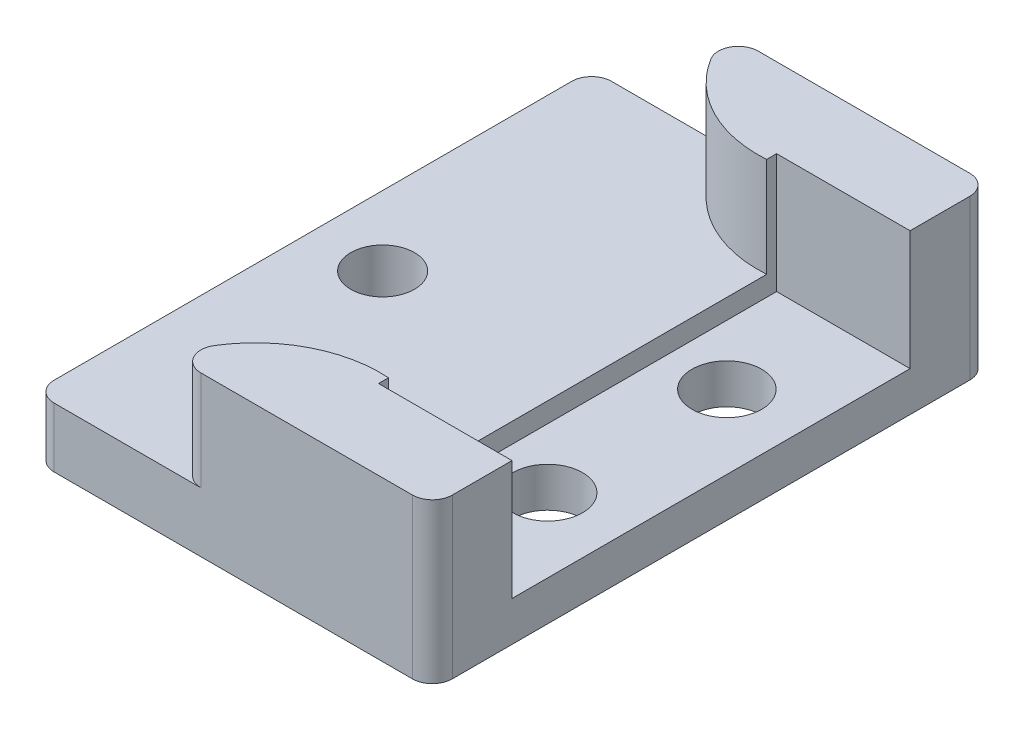
ISO-10303-21;
HEADER;
FILE_DESCRIPTION(('STEP AP214'),'2;1');
FILE_NAME('part.step','',(''),(''),'','','');
FILE_SCHEMA(('AUTOMOTIVE_DESIGN { 1 0 10303 214 1 1 1 1 }'));
ENDSEC;
DATA;
#1=APPLICATION_CONTEXT('core data for automotive mechanical design processes');
#2=APPLICATION_PROTOCOL_DEFINITION('international standard','automotive_design',2000,#1);
#3=PRODUCT_CONTEXT('',#1,'mechanical');
#4=PRODUCT('Part','Part','',(#3));
#5=PRODUCT_RELATED_PRODUCT_CATEGORY('part','',(#4));
#6=PRODUCT_DEFINITION_FORMATION('','',#4);
#7=PRODUCT_DEFINITION_CONTEXT('part definition',#1,'design');
#8=PRODUCT_DEFINITION('design','',#6,#7);
#9=PRODUCT_DEFINITION_SHAPE('','',#8);
#10=(LENGTH_UNIT() NAMED_UNIT(*) SI_UNIT(.MILLI.,.METRE.));
#11=(NAMED_UNIT(*) PLANE_ANGLE_UNIT() SI_UNIT($,.RADIAN.));
#12=(NAMED_UNIT(*) SI_UNIT($,.STERADIAN.) SOLID_ANGLE_UNIT());
#13=UNCERTAINTY_MEASURE_WITH_UNIT(LENGTH_MEASURE(1.E-05),#10,'distance_accuracy_value','');
#14=(GEOMETRIC_REPRESENTATION_CONTEXT(3) GLOBAL_UNCERTAINTY_ASSIGNED_CONTEXT((#13)) GLOBAL_UNIT_ASSIGNED_CONTEXT((#10,
#11,#12)) REPRESENTATION_CONTEXT('',''));
#15=CARTESIAN_POINT('',(0.,0.,0.));
#16=DIRECTION('',(0.,0.,1.));
#17=DIRECTION('',(1.,0.,0.));
#18=AXIS2_PLACEMENT_3D('',#15,#16,#17);
#19=CARTESIAN_POINT('',(-10.8433734939759,8.,-8.47389558232932));
#20=DIRECTION('',(1.,0.,0.));
#21=DIRECTION('',(0.,0.,-1.));
#22=AXIS2_PLACEMENT_3D('',#19,#20,#21);
#23=PLANE('',#22);
#24=DIRECTION('',(0.,0.,1.));
#25=VECTOR('',#24,1.);
#26=CARTESIAN_POINT('',(-10.8433734939759,3.,0.));
#27=LINE('',#26,#25);
#28=CARTESIAN_POINT('',(-10.8433734939759,3.,-7.47389558232932));
#29=VERTEX_POINT('',#28);
#30=CARTESIAN_POINT('',(-10.8433734939759,3.,18.5261044176707));
#31=VERTEX_POINT('',#30);
#32=EDGE_CURVE('E314',#29,#31,#27,.T.);
#33=ORIENTED_EDGE('',*,*,#32,.F.);
#34=DIRECTION('',(0.,-1.,0.));
#35=VECTOR('',#34,1.);
#36=CARTESIAN_POINT('',(-10.8433734939759,8.,-7.47389558232932));
#37=LINE('',#36,#35);
#38=CARTESIAN_POINT('',(-10.8433734939759,0.,-7.47389558232932));
#39=VERTEX_POINT('',#38);
#40=EDGE_CURVE('E284',#29,#39,#37,.T.);
#41=ORIENTED_EDGE('',*,*,#40,.T.);
#42=DIRECTION('',(0.,0.,1.));
#43=VECTOR('',#42,1.);
#44=CARTESIAN_POINT('',(-10.8433734939759,0.,-8.47389558232932));
#45=LINE('',#44,#43);
#46=CARTESIAN_POINT('',(-10.8433734939759,0.,18.5261044176707));
#47=VERTEX_POINT('',#46);
#48=EDGE_CURVE('E216',#39,#47,#45,.T.);
#49=ORIENTED_EDGE('',*,*,#48,.T.);
#50=DIRECTION('',(0.,-1.,0.));
#51=VECTOR('',#50,1.);
#52=CARTESIAN_POINT('',(-10.8433734939759,8.,18.5261044176707));
#53=LINE('',#52,#51);
#54=EDGE_CURVE('E48',#47,#31,#53,.F.);
#55=ORIENTED_EDGE('',*,*,#54,.T.);
#56=EDGE_LOOP('',(#33,#41,#49,#55));
#57=FACE_BOUND('',#56,.T.);
#58=ADVANCED_FACE('F33',(#57),#23,.F.);
#59=CARTESIAN_POINT('',(-10.8433734939759,8.,19.5261044176707));
#60=DIRECTION('',(0.,0.,-1.));
#61=DIRECTION('',(-1.,0.,0.));
#62=AXIS2_PLACEMENT_3D('',#59,#60,#61);
#63=PLANE('',#62);
#64=DIRECTION('',(1.,0.,0.));
#65=VECTOR('',#64,1.);
#66=CARTESIAN_POINT('',(-10.8433734939759,8.,19.5261044176707));
#67=LINE('',#66,#65);
#68=CARTESIAN_POINT('',(-2.47408756950972,8.,19.5261044176707));
#69=VERTEX_POINT('',#68);
#70=CARTESIAN_POINT('',(8.15662650602409,8.,19.5261044176707));
#71=VERTEX_POINT('',#70);
#72=EDGE_CURVE('E223',#69,#71,#67,.T.);
#73=ORIENTED_EDGE('',*,*,#72,.F.);
#74=DIRECTION('',(0.,-1.,0.));
#75=VECTOR('',#74,1.);
#76=CARTESIAN_POINT('',(-2.47408756950972,3.,19.5261044176707));
#77=LINE('',#76,#75);
#78=CARTESIAN_POINT('',(-2.47408756950972,3.,19.5261044176707));
#79=VERTEX_POINT('',#78);
#80=EDGE_CURVE('E267',#69,#79,#77,.T.);
#81=ORIENTED_EDGE('',*,*,#80,.T.);
#82=DIRECTION('',(1.,0.,0.));
#83=VECTOR('',#82,1.);
#84=CARTESIAN_POINT('',(0.,3.,19.5261044176707));
#85=LINE('',#84,#83);
#86=CARTESIAN_POINT('',(-9.8433734939759,3.,19.5261044176707));
#87=VERTEX_POINT('',#86);
#88=EDGE_CURVE('E190',#87,#79,#85,.T.);
#89=ORIENTED_EDGE('',*,*,#88,.F.);
#90=DIRECTION('',(0.,-1.,0.));
#91=VECTOR('',#90,1.);
#92=CARTESIAN_POINT('',(-9.8433734939759,8.,19.5261044176707));
#93=LINE('',#92,#91);
#94=CARTESIAN_POINT('',(-9.8433734939759,0.,19.5261044176707));
#95=VERTEX_POINT('',#94);
#96=EDGE_CURVE('E264',#87,#95,#93,.T.);
#97=ORIENTED_EDGE('',*,*,#96,.T.);
#98=DIRECTION('',(1.,0.,0.));
#99=VECTOR('',#98,1.);
#100=CARTESIAN_POINT('',(-10.8433734939759,0.,19.5261044176707));
#101=LINE('',#100,#99);
#102=CARTESIAN_POINT('',(8.15662650602409,0.,19.5261044176707));
#103=VERTEX_POINT('',#102);
#104=EDGE_CURVE('E235',#95,#103,#101,.T.);
#105=ORIENTED_EDGE('',*,*,#104,.T.);
#106=DIRECTION('',(0.,-1.,0.));
#107=VECTOR('',#106,1.);
#108=CARTESIAN_POINT('',(8.15662650602409,8.,19.5261044176707));
#109=LINE('',#108,#107);
#110=EDGE_CURVE('E262',#103,#71,#109,.F.);
#111=ORIENTED_EDGE('',*,*,#110,.T.);
#112=EDGE_LOOP('',(#73,#81,#89,#97,#105,#111));
#113=FACE_BOUND('',#112,.T.);
#114=ADVANCED_FACE('F347',(#113),#63,.F.);
#115=CARTESIAN_POINT('',(0.,8.,0.));
#116=DIRECTION('',(0.,1.,0.));
#117=DIRECTION('',(0.,0.,1.));
#118=AXIS2_PLACEMENT_3D('',#115,#116,#117);
#119=PLANE('',#118);
#120=CARTESIAN_POINT('',(2.02042580318858,8.,21.2850908464605));
#121=DIRECTION('',(0.,1.,0.));
#122=DIRECTION('',(0.,0.,1.));
#123=AXIS2_PLACEMENT_3D('',#120,#121,#122);
#124=CIRCLE('',#123,6.27377062182364);
#125=CARTESIAN_POINT('',(2.45087521889544,8.,15.0261044176707));
#126=VERTEX_POINT('',#125);
#127=CARTESIAN_POINT('',(-3.32632663999551,8.,18.0029518904499));
#128=VERTEX_POINT('',#127);
#129=EDGE_CURVE('E319',#126,#128,#124,.T.);
#130=ORIENTED_EDGE('',*,*,#129,.T.);
#131=CARTESIAN_POINT('',(-2.47408756950972,8.,18.5261044176707));
#132=DIRECTION('',(0.,1.,0.));
#133=DIRECTION('',(0.,0.,1.));
#134=AXIS2_PLACEMENT_3D('',#131,#132,#133);
#135=CIRCLE('',#134,1.);
#136=EDGE_CURVE('E260',#128,#69,#135,.T.);
#137=ORIENTED_EDGE('',*,*,#136,.T.);
#138=ORIENTED_EDGE('',*,*,#72,.T.);
#139=CARTESIAN_POINT('',(8.15662650602409,8.,18.5261044176707));
#140=DIRECTION('',(0.,1.,0.));
#141=DIRECTION('',(0.,0.,1.));
#142=AXIS2_PLACEMENT_3D('',#139,#140,#141);
#143=CIRCLE('',#142,1.);
#144=CARTESIAN_POINT('',(9.15662650602409,8.,18.5261044176707));
#145=VERTEX_POINT('',#144);
#146=EDGE_CURVE('E258',#71,#145,#143,.T.);
#147=ORIENTED_EDGE('',*,*,#146,.T.);
#148=DIRECTION('',(0.,0.,-1.));
#149=VECTOR('',#148,1.);
#150=CARTESIAN_POINT('',(9.15662650602409,8.,-8.47389558232932));
#151=LINE('',#150,#149);
#152=CARTESIAN_POINT('',(9.15662650602409,8.,15.5261044176707));
#153=VERTEX_POINT('',#152);
#154=EDGE_CURVE('E228',#145,#153,#151,.T.);
#155=ORIENTED_EDGE('',*,*,#154,.T.);
#156=DIRECTION('',(1.,0.,0.));
#157=VECTOR('',#156,1.);
#158=CARTESIAN_POINT('',(9.15662650602409,8.,15.5261044176707));
#159=LINE('',#158,#157);
#160=CARTESIAN_POINT('',(2.45087521889544,8.,15.5261044176707));
#161=VERTEX_POINT('',#160);
#162=EDGE_CURVE('E200',#161,#153,#159,.T.);
#163=ORIENTED_EDGE('',*,*,#162,.F.);
#164=DIRECTION('',(0.,0.,1.));
#165=VECTOR('',#164,1.);
#166=CARTESIAN_POINT('',(2.45087521889543,8.,-4.47389558232932));
#167=LINE('',#166,#165);
#168=EDGE_CURVE('E188',#126,#161,#167,.T.);
#169=ORIENTED_EDGE('',*,*,#168,.F.);
#170=EDGE_LOOP('',(#130,#137,#138,#147,#155,#163,#169));
#171=FACE_BOUND('',#170,.T.);
#172=ADVANCED_FACE('F344',(#171),#119,.T.);
#173=CARTESIAN_POINT('',(2.45087521889543,2.,-4.47389558232932));
#174=DIRECTION('',(-1.,0.,0.));
#175=DIRECTION('',(0.,0.,1.));
#176=AXIS2_PLACEMENT_3D('',#173,#174,#175);
#177=PLANE('',#176);
#178=DIRECTION('',(0.,1.,0.));
#179=VECTOR('',#178,1.);
#180=CARTESIAN_POINT('',(2.45087521889544,3.,15.0261044176707));
#181=LINE('',#180,#179);
#182=CARTESIAN_POINT('',(2.45087521889544,3.,15.0261044176707));
#183=VERTEX_POINT('',#182);
#184=EDGE_CURVE('E185',#183,#126,#181,.T.);
#185=ORIENTED_EDGE('',*,*,#184,.T.);
#186=ORIENTED_EDGE('',*,*,#168,.T.);
#187=DIRECTION('',(0.,1.,0.));
#188=VECTOR('',#187,1.);
#189=CARTESIAN_POINT('',(2.45087521889544,2.,15.5261044176707));
#190=LINE('',#189,#188);
#191=CARTESIAN_POINT('',(2.45087521889544,2.,15.5261044176707));
#192=VERTEX_POINT('',#191);
#193=EDGE_CURVE('E217',#192,#161,#190,.T.);
#194=ORIENTED_EDGE('',*,*,#193,.F.);
#195=DIRECTION('',(0.,0.,1.));
#196=VECTOR('',#195,1.);
#197=CARTESIAN_POINT('',(2.45087521889543,2.,-4.47389558232932));
#198=LINE('',#197,#196);
#199=CARTESIAN_POINT('',(2.45087521889543,2.,-4.47389558232932));
#200=VERTEX_POINT('',#199);
#201=EDGE_CURVE('E203',#200,#192,#198,.T.);
#202=ORIENTED_EDGE('',*,*,#201,.F.);
#203=DIRECTION('',(0.,1.,0.));
#204=VECTOR('',#203,1.);
#205=CARTESIAN_POINT('',(2.45087521889543,2.,-4.47389558232932));
#206=LINE('',#205,#204);
#207=CARTESIAN_POINT('',(2.45087521889543,8.,-4.47389558232932));
#208=VERTEX_POINT('',#207);
#209=EDGE_CURVE('E220',#200,#208,#206,.T.);
#210=ORIENTED_EDGE('',*,*,#209,.T.);
#211=CARTESIAN_POINT('',(2.45087521889543,8.,-3.97389558232932));
#212=VERTEX_POINT('',#211);
#213=EDGE_CURVE('E183',#208,#212,#167,.T.);
#214=ORIENTED_EDGE('',*,*,#213,.T.);
#215=DIRECTION('',(0.,1.,0.));
#216=VECTOR('',#215,1.);
#217=CARTESIAN_POINT('',(2.45087521889543,3.,-3.97389558232932));
#218=LINE('',#217,#216);
#219=CARTESIAN_POINT('',(2.45087521889543,3.,-3.97389558232932));
#220=VERTEX_POINT('',#219);
#221=EDGE_CURVE('E163',#220,#212,#218,.T.);
#222=ORIENTED_EDGE('',*,*,#221,.F.);
#223=DIRECTION('',(0.,0.,-1.));
#224=VECTOR('',#223,1.);
#225=CARTESIAN_POINT('',(2.45087521889543,3.,0.));
#226=LINE('',#225,#224);
#227=EDGE_CURVE('E170',#183,#220,#226,.T.);
#228=ORIENTED_EDGE('',*,*,#227,.F.);
#229=EDGE_LOOP('',(#185,#186,#194,#202,#210,#214,#222,#228));
#230=FACE_BOUND('',#229,.T.);
#231=ADVANCED_FACE('F181',(#230),#177,.F.);
#232=CARTESIAN_POINT('',(9.15662650602409,8.,-8.47389558232932));
#233=DIRECTION('',(-1.,0.,0.));
#234=DIRECTION('',(0.,0.,1.));
#235=AXIS2_PLACEMENT_3D('',#232,#233,#234);
#236=PLANE('',#235);
#237=DIRECTION('',(0.,0.,-1.));
#238=VECTOR('',#237,1.);
#239=CARTESIAN_POINT('',(9.15662650602409,0.,-8.47389558232932));
#240=LINE('',#239,#238);
#241=CARTESIAN_POINT('',(9.15662650602409,0.,18.5261044176707));
#242=VERTEX_POINT('',#241);
#243=CARTESIAN_POINT('',(9.15662650602409,0.,-7.47389558232932));
#244=VERTEX_POINT('',#243);
#245=EDGE_CURVE('E238',#242,#244,#240,.T.);
#246=ORIENTED_EDGE('',*,*,#245,.T.);
#247=DIRECTION('',(0.,-1.,0.));
#248=VECTOR('',#247,1.);
#249=CARTESIAN_POINT('',(9.15662650602409,8.,-7.47389558232932));
#250=LINE('',#249,#248);
#251=CARTESIAN_POINT('',(9.15662650602409,8.,-7.47389558232932));
#252=VERTEX_POINT('',#251);
#253=EDGE_CURVE('E281',#244,#252,#250,.F.);
#254=ORIENTED_EDGE('',*,*,#253,.T.);
#255=CARTESIAN_POINT('',(9.15662650602409,8.,-4.47389558232932));
#256=VERTEX_POINT('',#255);
#257=EDGE_CURVE('E226',#256,#252,#151,.T.);
#258=ORIENTED_EDGE('',*,*,#257,.F.);
#259=DIRECTION('',(0.,1.,0.));
#260=VECTOR('',#259,1.);
#261=CARTESIAN_POINT('',(9.15662650602409,2.,-4.47389558232932));
#262=LINE('',#261,#260);
#263=CARTESIAN_POINT('',(9.15662650602409,2.,-4.47389558232932));
#264=VERTEX_POINT('',#263);
#265=EDGE_CURVE('E208',#264,#256,#262,.T.);
#266=ORIENTED_EDGE('',*,*,#265,.F.);
#267=DIRECTION('',(0.,0.,-1.));
#268=VECTOR('',#267,1.);
#269=CARTESIAN_POINT('',(9.15662650602409,2.,-4.47389558232932));
#270=LINE('',#269,#268);
#271=CARTESIAN_POINT('',(9.15662650602409,2.,15.5261044176707));
#272=VERTEX_POINT('',#271);
#273=EDGE_CURVE('E196',#272,#264,#270,.T.);
#274=ORIENTED_EDGE('',*,*,#273,.F.);
#275=DIRECTION('',(0.,1.,0.));
#276=VECTOR('',#275,1.);
#277=CARTESIAN_POINT('',(9.15662650602409,2.,15.5261044176707));
#278=LINE('',#277,#276);
#279=EDGE_CURVE('E213',#272,#153,#278,.T.);
#280=ORIENTED_EDGE('',*,*,#279,.T.);
#281=ORIENTED_EDGE('',*,*,#154,.F.);
#282=DIRECTION('',(0.,-1.,0.));
#283=VECTOR('',#282,1.);
#284=CARTESIAN_POINT('',(9.15662650602409,8.,18.5261044176707));
#285=LINE('',#284,#283);
#286=EDGE_CURVE('E278',#145,#242,#285,.T.);
#287=ORIENTED_EDGE('',*,*,#286,.T.);
#288=EDGE_LOOP('',(#246,#254,#258,#266,#274,#280,#281,#287));
#289=FACE_BOUND('',#288,.T.);
#290=ADVANCED_FACE('F356',(#289),#236,.F.);
#291=CARTESIAN_POINT('',(-10.8433734939759,8.,-8.47389558232932));
#292=DIRECTION('',(0.,0.,1.));
#293=DIRECTION('',(1.,0.,0.));
#294=AXIS2_PLACEMENT_3D('',#291,#292,#293);
#295=PLANE('',#294);
#296=DIRECTION('',(-1.,0.,0.));
#297=VECTOR('',#296,1.);
#298=CARTESIAN_POINT('',(0.,3.,-8.47389558232932));
#299=LINE('',#298,#297);
#300=CARTESIAN_POINT('',(-2.47408756950971,3.,-8.47389558232932));
#301=VERTEX_POINT('',#300);
#302=CARTESIAN_POINT('',(-9.84337349397591,3.,-8.47389558232932));
#303=VERTEX_POINT('',#302);
#304=EDGE_CURVE('E169',#301,#303,#299,.T.);
#305=ORIENTED_EDGE('',*,*,#304,.F.);
#306=DIRECTION('',(0.,1.,0.));
#307=VECTOR('',#306,1.);
#308=CARTESIAN_POINT('',(-2.47408756950971,8.,-8.47389558232932));
#309=LINE('',#308,#307);
#310=CARTESIAN_POINT('',(-2.47408756950971,8.,-8.47389558232932));
#311=VERTEX_POINT('',#310);
#312=EDGE_CURVE('E247',#301,#311,#309,.T.);
#313=ORIENTED_EDGE('',*,*,#312,.T.);
#314=DIRECTION('',(-1.,0.,0.));
#315=VECTOR('',#314,1.);
#316=CARTESIAN_POINT('',(-10.8433734939759,8.,-8.47389558232932));
#317=LINE('',#316,#315);
#318=CARTESIAN_POINT('',(8.15662650602409,8.,-8.47389558232932));
#319=VERTEX_POINT('',#318);
#320=EDGE_CURVE('E230',#319,#311,#317,.T.);
#321=ORIENTED_EDGE('',*,*,#320,.F.);
#322=DIRECTION('',(0.,-1.,0.));
#323=VECTOR('',#322,1.);
#324=CARTESIAN_POINT('',(8.15662650602409,8.,-8.47389558232932));
#325=LINE('',#324,#323);
#326=CARTESIAN_POINT('',(8.15662650602409,0.,-8.47389558232932));
#327=VERTEX_POINT('',#326);
#328=EDGE_CURVE('E244',#319,#327,#325,.T.);
#329=ORIENTED_EDGE('',*,*,#328,.T.);
#330=DIRECTION('',(-1.,0.,0.));
#331=VECTOR('',#330,1.);
#332=CARTESIAN_POINT('',(-10.8433734939759,0.,-8.47389558232932));
#333=LINE('',#332,#331);
#334=CARTESIAN_POINT('',(-9.84337349397591,0.,-8.47389558232932));
#335=VERTEX_POINT('',#334);
#336=EDGE_CURVE('E227',#327,#335,#333,.T.);
#337=ORIENTED_EDGE('',*,*,#336,.T.);
#338=DIRECTION('',(0.,-1.,0.));
#339=VECTOR('',#338,1.);
#340=CARTESIAN_POINT('',(-9.84337349397591,8.,-8.47389558232932));
#341=LINE('',#340,#339);
#342=EDGE_CURVE('E233',#335,#303,#341,.F.);
#343=ORIENTED_EDGE('',*,*,#342,.T.);
#344=EDGE_LOOP('',(#305,#313,#321,#329,#337,#343));
#345=FACE_BOUND('',#344,.T.);
#346=ADVANCED_FACE('F294',(#345),#295,.F.);
#347=ORIENTED_EDGE('',*,*,#320,.T.);
#348=CARTESIAN_POINT('',(-2.47408756950971,8.,-7.47389558232932));
#349=DIRECTION('',(0.,1.,0.));
#350=DIRECTION('',(0.,0.,1.));
#351=AXIS2_PLACEMENT_3D('',#348,#349,#350);
#352=CIRCLE('',#351,1.);
#353=CARTESIAN_POINT('',(-3.32632663999551,8.,-6.95074305510852));
#354=VERTEX_POINT('',#353);
#355=EDGE_CURVE('E252',#311,#354,#352,.T.);
#356=ORIENTED_EDGE('',*,*,#355,.T.);
#357=CARTESIAN_POINT('',(2.02042580318858,8.,-10.2328820111191));
#358=DIRECTION('',(0.,1.,0.));
#359=DIRECTION('',(0.,0.,1.));
#360=AXIS2_PLACEMENT_3D('',#357,#358,#359);
#361=CIRCLE('',#360,6.27377062182364);
#362=EDGE_CURVE('E193',#212,#354,#361,.F.);
#363=ORIENTED_EDGE('',*,*,#362,.F.);
#364=ORIENTED_EDGE('',*,*,#213,.F.);
#365=DIRECTION('',(-1.,0.,0.));
#366=VECTOR('',#365,1.);
#367=CARTESIAN_POINT('',(9.15662650602409,8.,-4.47389558232932));
#368=LINE('',#367,#366);
#369=EDGE_CURVE('E184',#256,#208,#368,.T.);
#370=ORIENTED_EDGE('',*,*,#369,.F.);
#371=ORIENTED_EDGE('',*,*,#257,.T.);
#372=CARTESIAN_POINT('',(8.15662650602409,8.,-7.47389558232932));
#373=DIRECTION('',(0.,1.,0.));
#374=DIRECTION('',(0.,0.,1.));
#375=AXIS2_PLACEMENT_3D('',#372,#373,#374);
#376=CIRCLE('',#375,1.);
#377=EDGE_CURVE('E250',#252,#319,#376,.T.);
#378=ORIENTED_EDGE('',*,*,#377,.T.);
#379=EDGE_LOOP('',(#347,#356,#363,#364,#370,#371,#378));
#380=FACE_BOUND('',#379,.T.);
#381=ADVANCED_FACE('F297',(#380),#119,.T.);
#382=CARTESIAN_POINT('',(0.,0.,0.));
#383=DIRECTION('',(0.,1.,0.));
#384=DIRECTION('',(0.,0.,1.));
#385=AXIS2_PLACEMENT_3D('',#382,#383,#384);
#386=PLANE('',#385);
#387=CARTESIAN_POINT('',(5.45087521889543,0.,10.0261044176707));
#388=DIRECTION('',(0.,1.,0.));
#389=DIRECTION('',(0.,0.,1.));
#390=AXIS2_PLACEMENT_3D('',#387,#388,#389);
#391=CIRCLE('',#390,1.75);
#392=CARTESIAN_POINT('',(5.45087521889543,0.,11.7761044176707));
#393=VERTEX_POINT('',#392);
#394=EDGE_CURVE('E565',#393,#393,#391,.T.);
#395=ORIENTED_EDGE('',*,*,#394,.T.);
#396=EDGE_LOOP('',(#395));
#397=FACE_BOUND('',#396,.T.);
#398=CARTESIAN_POINT('',(5.45087521889543,0.,1.02610441767068));
#399=DIRECTION('',(0.,1.,0.));
#400=DIRECTION('',(0.,0.,1.));
#401=AXIS2_PLACEMENT_3D('',#398,#399,#400);
#402=CIRCLE('',#401,1.75);
#403=CARTESIAN_POINT('',(5.45087521889543,0.,2.77610441767068));
#404=VERTEX_POINT('',#403);
#405=EDGE_CURVE('E330',#404,#404,#402,.T.);
#406=ORIENTED_EDGE('',*,*,#405,.T.);
#407=EDGE_LOOP('',(#406));
#408=FACE_BOUND('',#407,.T.);
#409=CARTESIAN_POINT('',(-7.34337349397591,0.,5.52610441767068));
#410=DIRECTION('',(0.,1.,0.));
#411=DIRECTION('',(0.,0.,1.));
#412=AXIS2_PLACEMENT_3D('',#409,#410,#411);
#413=CIRCLE('',#412,1.6);
#414=CARTESIAN_POINT('',(-7.34337349397591,0.,7.12610441767068));
#415=VERTEX_POINT('',#414);
#416=EDGE_CURVE('E321',#415,#415,#413,.T.);
#417=ORIENTED_EDGE('',*,*,#416,.T.);
#418=EDGE_LOOP('',(#417));
#419=FACE_BOUND('',#418,.T.);
#420=ORIENTED_EDGE('',*,*,#336,.F.);
#421=CARTESIAN_POINT('',(8.15662650602409,0.,-7.47389558232932));
#422=DIRECTION('',(0.,1.,0.));
#423=DIRECTION('',(0.,0.,1.));
#424=AXIS2_PLACEMENT_3D('',#421,#422,#423);
#425=CIRCLE('',#424,1.);
#426=EDGE_CURVE('E276',#327,#244,#425,.F.);
#427=ORIENTED_EDGE('',*,*,#426,.T.);
#428=ORIENTED_EDGE('',*,*,#245,.F.);
#429=CARTESIAN_POINT('',(8.15662650602409,0.,18.5261044176707));
#430=DIRECTION('',(0.,1.,0.));
#431=DIRECTION('',(0.,0.,1.));
#432=AXIS2_PLACEMENT_3D('',#429,#430,#431);
#433=CIRCLE('',#432,1.);
#434=EDGE_CURVE('E270',#242,#103,#433,.F.);
#435=ORIENTED_EDGE('',*,*,#434,.T.);
#436=ORIENTED_EDGE('',*,*,#104,.F.);
#437=CARTESIAN_POINT('',(-9.8433734939759,0.,18.5261044176707));
#438=DIRECTION('',(0.,1.,0.));
#439=DIRECTION('',(0.,0.,1.));
#440=AXIS2_PLACEMENT_3D('',#437,#438,#439);
#441=CIRCLE('',#440,1.);
#442=EDGE_CURVE('E272',#95,#47,#441,.F.);
#443=ORIENTED_EDGE('',*,*,#442,.T.);
#444=ORIENTED_EDGE('',*,*,#48,.F.);
#445=CARTESIAN_POINT('',(-9.84337349397591,0.,-7.47389558232932));
#446=DIRECTION('',(0.,1.,0.));
#447=DIRECTION('',(0.,0.,1.));
#448=AXIS2_PLACEMENT_3D('',#445,#446,#447);
#449=CIRCLE('',#448,1.);
#450=EDGE_CURVE('E274',#39,#335,#449,.F.);
#451=ORIENTED_EDGE('',*,*,#450,.T.);
#452=EDGE_LOOP('',(#420,#427,#428,#435,#436,#443,#444,#451));
#453=FACE_BOUND('',#452,.T.);
#454=ADVANCED_FACE('F308',(#397,#408,#419,#453),#386,.F.);
#455=CARTESIAN_POINT('',(9.15662650602409,2.,15.5261044176707));
#456=DIRECTION('',(0.,0.,1.));
#457=DIRECTION('',(1.,0.,0.));
#458=AXIS2_PLACEMENT_3D('',#455,#456,#457);
#459=PLANE('',#458);
#460=ORIENTED_EDGE('',*,*,#162,.T.);
#461=ORIENTED_EDGE('',*,*,#279,.F.);
#462=DIRECTION('',(1.,0.,0.));
#463=VECTOR('',#462,1.);
#464=CARTESIAN_POINT('',(9.15662650602409,2.,15.5261044176707));
#465=LINE('',#464,#463);
#466=EDGE_CURVE('E206',#192,#272,#465,.T.);
#467=ORIENTED_EDGE('',*,*,#466,.F.);
#468=ORIENTED_EDGE('',*,*,#193,.T.);
#469=EDGE_LOOP('',(#460,#461,#467,#468));
#470=FACE_BOUND('',#469,.T.);
#471=ADVANCED_FACE('F361',(#470),#459,.F.);
#472=CARTESIAN_POINT('',(9.15662650602409,2.,-4.47389558232932));
#473=DIRECTION('',(0.,0.,-1.));
#474=DIRECTION('',(-1.,0.,0.));
#475=AXIS2_PLACEMENT_3D('',#472,#473,#474);
#476=PLANE('',#475);
#477=ORIENTED_EDGE('',*,*,#369,.T.);
#478=ORIENTED_EDGE('',*,*,#209,.F.);
#479=DIRECTION('',(-1.,0.,0.));
#480=VECTOR('',#479,1.);
#481=CARTESIAN_POINT('',(9.15662650602409,2.,-4.47389558232932));
#482=LINE('',#481,#480);
#483=EDGE_CURVE('E199',#264,#200,#482,.T.);
#484=ORIENTED_EDGE('',*,*,#483,.F.);
#485=ORIENTED_EDGE('',*,*,#265,.T.);
#486=EDGE_LOOP('',(#477,#478,#484,#485));
#487=FACE_BOUND('',#486,.T.);
#488=ADVANCED_FACE('F366',(#487),#476,.F.);
#489=CARTESIAN_POINT('',(0.,2.,0.));
#490=DIRECTION('',(0.,-1.,0.));
#491=DIRECTION('',(0.,0.,-1.));
#492=AXIS2_PLACEMENT_3D('',#489,#490,#491);
#493=PLANE('',#492);
#494=CARTESIAN_POINT('',(5.45087521889543,2.,10.0261044176707));
#495=DIRECTION('',(0.,1.,0.));
#496=DIRECTION('',(0.,0.,1.));
#497=AXIS2_PLACEMENT_3D('',#494,#495,#496);
#498=CIRCLE('',#497,1.75);
#499=CARTESIAN_POINT('',(5.45087521889543,2.,11.7761044176707));
#500=VERTEX_POINT('',#499);
#501=EDGE_CURVE('E568',#500,#500,#498,.T.);
#502=ORIENTED_EDGE('',*,*,#501,.F.);
#503=EDGE_LOOP('',(#502));
#504=FACE_BOUND('',#503,.T.);
#505=CARTESIAN_POINT('',(5.45087521889543,2.,1.02610441767068));
#506=DIRECTION('',(0.,1.,0.));
#507=DIRECTION('',(0.,0.,1.));
#508=AXIS2_PLACEMENT_3D('',#505,#506,#507);
#509=CIRCLE('',#508,1.75);
#510=CARTESIAN_POINT('',(5.45087521889543,2.,2.77610441767068));
#511=VERTEX_POINT('',#510);
#512=EDGE_CURVE('E333',#511,#511,#509,.T.);
#513=ORIENTED_EDGE('',*,*,#512,.F.);
#514=EDGE_LOOP('',(#513));
#515=FACE_BOUND('',#514,.T.);
#516=ORIENTED_EDGE('',*,*,#273,.T.);
#517=ORIENTED_EDGE('',*,*,#483,.T.);
#518=ORIENTED_EDGE('',*,*,#201,.T.);
#519=ORIENTED_EDGE('',*,*,#466,.T.);
#520=EDGE_LOOP('',(#516,#517,#518,#519));
#521=FACE_BOUND('',#520,.T.);
#522=ADVANCED_FACE('F363',(#504,#515,#521),#493,.F.);
#523=CARTESIAN_POINT('',(2.02042580318858,3.,21.2850908464605));
#524=DIRECTION('',(0.,1.,0.));
#525=DIRECTION('',(0.,0.,1.));
#526=AXIS2_PLACEMENT_3D('',#523,#524,#525);
#527=CYLINDRICAL_SURFACE('',#526,6.27377062182364);
#528=CARTESIAN_POINT('',(2.02042580318858,3.,21.2850908464605));
#529=DIRECTION('',(0.,1.,0.));
#530=DIRECTION('',(0.,0.,1.));
#531=AXIS2_PLACEMENT_3D('',#528,#529,#530);
#532=CIRCLE('',#531,6.27377062182364);
#533=CARTESIAN_POINT('',(-3.32632663999551,3.,18.0029518904499));
#534=VERTEX_POINT('',#533);
#535=EDGE_CURVE('E175',#183,#534,#532,.T.);
#536=ORIENTED_EDGE('',*,*,#535,.T.);
#537=DIRECTION('',(0.,1.,0.));
#538=VECTOR('',#537,1.);
#539=CARTESIAN_POINT('',(-3.32632663999551,3.,18.0029518904499));
#540=LINE('',#539,#538);
#541=EDGE_CURVE('E255',#534,#128,#540,.T.);
#542=ORIENTED_EDGE('',*,*,#541,.T.);
#543=ORIENTED_EDGE('',*,*,#129,.F.);
#544=ORIENTED_EDGE('',*,*,#184,.F.);
#545=EDGE_LOOP('',(#536,#542,#543,#544));
#546=FACE_BOUND('',#545,.T.);
#547=ADVANCED_FACE('F338',(#546),#527,.T.);
#548=CARTESIAN_POINT('',(2.02042580318858,3.,-10.2328820111191));
#549=DIRECTION('',(0.,1.,0.));
#550=DIRECTION('',(0.,0.,1.));
#551=AXIS2_PLACEMENT_3D('',#548,#549,#550);
#552=CYLINDRICAL_SURFACE('',#551,6.27377062182364);
#553=ORIENTED_EDGE('',*,*,#362,.T.);
#554=DIRECTION('',(0.,1.,0.));
#555=VECTOR('',#554,1.);
#556=CARTESIAN_POINT('',(-3.32632663999551,3.,-6.95074305510852));
#557=LINE('',#556,#555);
#558=CARTESIAN_POINT('',(-3.32632663999551,3.,-6.95074305510852));
#559=VERTEX_POINT('',#558);
#560=EDGE_CURVE('E166',#354,#559,#557,.F.);
#561=ORIENTED_EDGE('',*,*,#560,.T.);
#562=CARTESIAN_POINT('',(2.02042580318858,3.,-10.2328820111191));
#563=DIRECTION('',(0.,1.,0.));
#564=DIRECTION('',(0.,0.,1.));
#565=AXIS2_PLACEMENT_3D('',#562,#563,#564);
#566=CIRCLE('',#565,6.27377062182364);
#567=EDGE_CURVE('E158',#220,#559,#566,.F.);
#568=ORIENTED_EDGE('',*,*,#567,.F.);
#569=ORIENTED_EDGE('',*,*,#221,.T.);
#570=EDGE_LOOP('',(#553,#561,#568,#569));
#571=FACE_BOUND('',#570,.T.);
#572=ADVANCED_FACE('F161',(#571),#552,.T.);
#573=CARTESIAN_POINT('',(0.,3.,0.));
#574=DIRECTION('',(0.,1.,0.));
#575=DIRECTION('',(0.,0.,1.));
#576=AXIS2_PLACEMENT_3D('',#573,#574,#575);
#577=PLANE('',#576);
#578=CARTESIAN_POINT('',(-7.34337349397591,3.,5.52610441767068));
#579=DIRECTION('',(0.,1.,0.));
#580=DIRECTION('',(0.,0.,1.));
#581=AXIS2_PLACEMENT_3D('',#578,#579,#580);
#582=CIRCLE('',#581,1.6);
#583=CARTESIAN_POINT('',(-7.34337349397591,3.,7.12610441767068));
#584=VERTEX_POINT('',#583);
#585=EDGE_CURVE('E325',#584,#584,#582,.T.);
#586=ORIENTED_EDGE('',*,*,#585,.F.);
#587=EDGE_LOOP('',(#586));
#588=FACE_BOUND('',#587,.T.);
#589=ORIENTED_EDGE('',*,*,#304,.T.);
#590=CARTESIAN_POINT('',(-9.84337349397591,3.,-7.47389558232932));
#591=DIRECTION('',(0.,1.,0.));
#592=DIRECTION('',(0.,0.,1.));
#593=AXIS2_PLACEMENT_3D('',#590,#591,#592);
#594=CIRCLE('',#593,1.);
#595=EDGE_CURVE('E55',#303,#29,#594,.T.);
#596=ORIENTED_EDGE('',*,*,#595,.T.);
#597=ORIENTED_EDGE('',*,*,#32,.T.);
#598=CARTESIAN_POINT('',(-9.8433734939759,3.,18.5261044176707));
#599=DIRECTION('',(0.,1.,0.));
#600=DIRECTION('',(0.,0.,1.));
#601=AXIS2_PLACEMENT_3D('',#598,#599,#600);
#602=CIRCLE('',#601,1.);
#603=EDGE_CURVE('E287',#31,#87,#602,.T.);
#604=ORIENTED_EDGE('',*,*,#603,.T.);
#605=ORIENTED_EDGE('',*,*,#88,.T.);
#606=CARTESIAN_POINT('',(-2.47408756950972,3.,18.5261044176707));
#607=DIRECTION('',(0.,1.,0.));
#608=DIRECTION('',(0.,0.,1.));
#609=AXIS2_PLACEMENT_3D('',#606,#607,#608);
#610=CIRCLE('',#609,1.);
#611=EDGE_CURVE('E11',#79,#534,#610,.F.);
#612=ORIENTED_EDGE('',*,*,#611,.T.);
#613=ORIENTED_EDGE('',*,*,#535,.F.);
#614=ORIENTED_EDGE('',*,*,#227,.T.);
#615=ORIENTED_EDGE('',*,*,#567,.T.);
#616=CARTESIAN_POINT('',(-2.47408756950971,3.,-7.47389558232932));
#617=DIRECTION('',(0.,1.,0.));
#618=DIRECTION('',(0.,0.,1.));
#619=AXIS2_PLACEMENT_3D('',#616,#617,#618);
#620=CIRCLE('',#619,1.);
#621=EDGE_CURVE('E41',#559,#301,#620,.F.);
#622=ORIENTED_EDGE('',*,*,#621,.T.);
#623=EDGE_LOOP('',(#589,#596,#597,#604,#605,#612,#613,#614,#615,#622));
#624=FACE_BOUND('',#623,.T.);
#625=ADVANCED_FACE('F173',(#588,#624),#577,.T.);
#626=CARTESIAN_POINT('',(-7.34337349397591,0.,5.52610441767068));
#627=DIRECTION('',(0.,1.,0.));
#628=DIRECTION('',(0.,0.,1.));
#629=AXIS2_PLACEMENT_3D('',#626,#627,#628);
#630=CYLINDRICAL_SURFACE('',#629,1.6);
#631=ORIENTED_EDGE('',*,*,#416,.F.);
#632=EDGE_LOOP('',(#631));
#633=FACE_BOUND('',#632,.T.);
#634=ORIENTED_EDGE('',*,*,#585,.T.);
#635=EDGE_LOOP('',(#634));
#636=FACE_BOUND('',#635,.T.);
#637=ADVANCED_FACE('F387',(#633,#636),#630,.F.);
#638=CARTESIAN_POINT('',(-2.47408756950971,3.,-7.47389558232932));
#639=DIRECTION('',(0.,1.,0.));
#640=DIRECTION('',(0.,0.,1.));
#641=AXIS2_PLACEMENT_3D('',#638,#639,#640);
#642=CYLINDRICAL_SURFACE('',#641,1.);
#643=ORIENTED_EDGE('',*,*,#621,.F.);
#644=ORIENTED_EDGE('',*,*,#560,.F.);
#645=ORIENTED_EDGE('',*,*,#355,.F.);
#646=ORIENTED_EDGE('',*,*,#312,.F.);
#647=EDGE_LOOP('',(#643,#644,#645,#646));
#648=FACE_BOUND('',#647,.T.);
#649=ADVANCED_FACE('F291',(#648),#642,.T.);
#650=CARTESIAN_POINT('',(-2.47408756950972,3.,18.5261044176707));
#651=DIRECTION('',(0.,1.,0.));
#652=DIRECTION('',(0.,0.,1.));
#653=AXIS2_PLACEMENT_3D('',#650,#651,#652);
#654=CYLINDRICAL_SURFACE('',#653,1.);
#655=ORIENTED_EDGE('',*,*,#611,.F.);
#656=ORIENTED_EDGE('',*,*,#80,.F.);
#657=ORIENTED_EDGE('',*,*,#136,.F.);
#658=ORIENTED_EDGE('',*,*,#541,.F.);
#659=EDGE_LOOP('',(#655,#656,#657,#658));
#660=FACE_BOUND('',#659,.T.);
#661=ADVANCED_FACE('F341',(#660),#654,.T.);
#662=CARTESIAN_POINT('',(8.15662650602409,8.,-7.47389558232932));
#663=DIRECTION('',(0.,-1.,0.));
#664=DIRECTION('',(0.,0.,-1.));
#665=AXIS2_PLACEMENT_3D('',#662,#663,#664);
#666=CYLINDRICAL_SURFACE('',#665,1.);
#667=ORIENTED_EDGE('',*,*,#377,.F.);
#668=ORIENTED_EDGE('',*,*,#253,.F.);
#669=ORIENTED_EDGE('',*,*,#426,.F.);
#670=ORIENTED_EDGE('',*,*,#328,.F.);
#671=EDGE_LOOP('',(#667,#668,#669,#670));
#672=FACE_BOUND('',#671,.T.);
#673=ADVANCED_FACE('F304',(#672),#666,.T.);
#674=CARTESIAN_POINT('',(-9.84337349397591,8.,-7.47389558232932));
#675=DIRECTION('',(0.,-1.,0.));
#676=DIRECTION('',(0.,0.,-1.));
#677=AXIS2_PLACEMENT_3D('',#674,#675,#676);
#678=CYLINDRICAL_SURFACE('',#677,1.);
#679=ORIENTED_EDGE('',*,*,#595,.F.);
#680=ORIENTED_EDGE('',*,*,#342,.F.);
#681=ORIENTED_EDGE('',*,*,#450,.F.);
#682=ORIENTED_EDGE('',*,*,#40,.F.);
#683=EDGE_LOOP('',(#679,#680,#681,#682));
#684=FACE_BOUND('',#683,.T.);
#685=ADVANCED_FACE('F313',(#684),#678,.T.);
#686=CARTESIAN_POINT('',(-9.8433734939759,8.,18.5261044176707));
#687=DIRECTION('',(0.,-1.,0.));
#688=DIRECTION('',(0.,0.,-1.));
#689=AXIS2_PLACEMENT_3D('',#686,#687,#688);
#690=CYLINDRICAL_SURFACE('',#689,1.);
#691=ORIENTED_EDGE('',*,*,#603,.F.);
#692=ORIENTED_EDGE('',*,*,#54,.F.);
#693=ORIENTED_EDGE('',*,*,#442,.F.);
#694=ORIENTED_EDGE('',*,*,#96,.F.);
#695=EDGE_LOOP('',(#691,#692,#693,#694));
#696=FACE_BOUND('',#695,.T.);
#697=ADVANCED_FACE('F369',(#696),#690,.T.);
#698=CARTESIAN_POINT('',(8.15662650602409,8.,18.5261044176707));
#699=DIRECTION('',(0.,-1.,0.));
#700=DIRECTION('',(0.,0.,-1.));
#701=AXIS2_PLACEMENT_3D('',#698,#699,#700);
#702=CYLINDRICAL_SURFACE('',#701,1.);
#703=ORIENTED_EDGE('',*,*,#146,.F.);
#704=ORIENTED_EDGE('',*,*,#110,.F.);
#705=ORIENTED_EDGE('',*,*,#434,.F.);
#706=ORIENTED_EDGE('',*,*,#286,.F.);
#707=EDGE_LOOP('',(#703,#704,#705,#706));
#708=FACE_BOUND('',#707,.T.);
#709=ADVANCED_FACE('F35',(#708),#702,.T.);
#710=CARTESIAN_POINT('',(5.45087521889543,0.,1.02610441767068));
#711=DIRECTION('',(0.,1.,0.));
#712=DIRECTION('',(0.,0.,1.));
#713=AXIS2_PLACEMENT_3D('',#710,#711,#712);
#714=CYLINDRICAL_SURFACE('',#713,1.75);
#715=ORIENTED_EDGE('',*,*,#405,.F.);
#716=EDGE_LOOP('',(#715));
#717=FACE_BOUND('',#716,.T.);
#718=ORIENTED_EDGE('',*,*,#512,.T.);
#719=EDGE_LOOP('',(#718));
#720=FACE_BOUND('',#719,.T.);
#721=ADVANCED_FACE('F375',(#717,#720),#714,.F.);
#722=CARTESIAN_POINT('',(5.45087521889543,0.,10.0261044176707));
#723=DIRECTION('',(0.,1.,0.));
#724=DIRECTION('',(0.,0.,1.));
#725=AXIS2_PLACEMENT_3D('',#722,#723,#724);
#726=CYLINDRICAL_SURFACE('',#725,1.75);
#727=ORIENTED_EDGE('',*,*,#394,.F.);
#728=EDGE_LOOP('',(#727));
#729=FACE_BOUND('',#728,.T.);
#730=ORIENTED_EDGE('',*,*,#501,.T.);
#731=EDGE_LOOP('',(#730));
#732=FACE_BOUND('',#731,.T.);
#733=ADVANCED_FACE('F444',(#729,#732),#726,.F.);
#734=CLOSED_SHELL('',(#58,#114,#172,#231,#290,#346,#381,#454,#471,#488,#522,#547,#572,#625,#637,
#649,#661,#673,#685,#697,#709,#721,#733));
#735=MANIFOLD_SOLID_BREP('B2',#734);
#736=ADVANCED_BREP_SHAPE_REPRESENTATION('',(#18,#735),#14);
#737=SHAPE_DEFINITION_REPRESENTATION(#9,#736);
ENDSEC;
END-ISO-10303-21;
